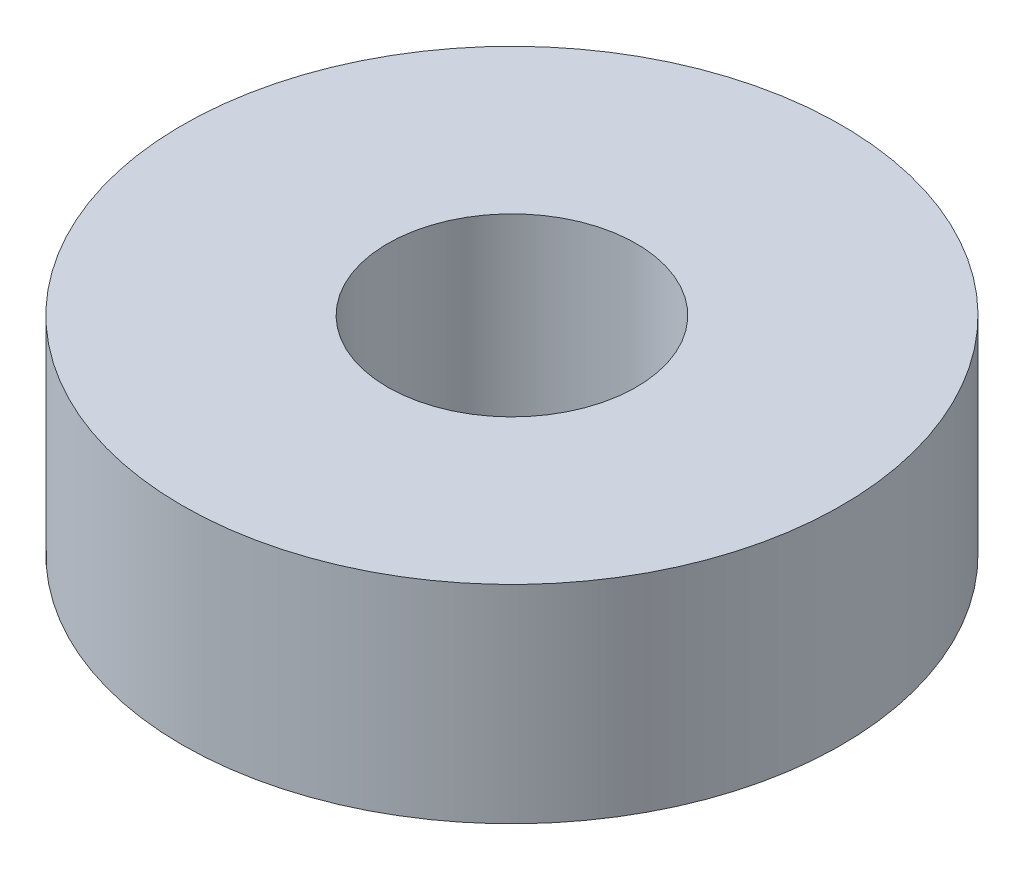
ISO-10303-21;
HEADER;
FILE_DESCRIPTION(('STEP AP214'),'2;1');
FILE_NAME('part.step','',(''),(''),'','','');
FILE_SCHEMA(('AUTOMOTIVE_DESIGN { 1 0 10303 214 1 1 1 1 }'));
ENDSEC;
DATA;
#1=APPLICATION_CONTEXT('core data for automotive mechanical design processes');
#2=APPLICATION_PROTOCOL_DEFINITION('international standard','automotive_design',2000,#1);
#3=PRODUCT_CONTEXT('',#1,'mechanical');
#4=PRODUCT('Part','Part','',(#3));
#5=PRODUCT_RELATED_PRODUCT_CATEGORY('part','',(#4));
#6=PRODUCT_DEFINITION_FORMATION('','',#4);
#7=PRODUCT_DEFINITION_CONTEXT('part definition',#1,'design');
#8=PRODUCT_DEFINITION('design','',#6,#7);
#9=PRODUCT_DEFINITION_SHAPE('','',#8);
#10=(LENGTH_UNIT() NAMED_UNIT(*) SI_UNIT(.MILLI.,.METRE.));
#11=(NAMED_UNIT(*) PLANE_ANGLE_UNIT() SI_UNIT($,.RADIAN.));
#12=(NAMED_UNIT(*) SI_UNIT($,.STERADIAN.) SOLID_ANGLE_UNIT());
#13=UNCERTAINTY_MEASURE_WITH_UNIT(LENGTH_MEASURE(1.E-05),#10,'distance_accuracy_value','');
#14=(GEOMETRIC_REPRESENTATION_CONTEXT(3) GLOBAL_UNCERTAINTY_ASSIGNED_CONTEXT((#13)) GLOBAL_UNIT_ASSIGNED_CONTEXT((#10,
#11,#12)) REPRESENTATION_CONTEXT('',''));
#15=CARTESIAN_POINT('',(0.,0.,0.));
#16=DIRECTION('',(0.,0.,1.));
#17=DIRECTION('',(1.,0.,0.));
#18=AXIS2_PLACEMENT_3D('',#15,#16,#17);
#19=CARTESIAN_POINT('',(0.,5.,0.));
#20=DIRECTION('',(0.,1.,0.));
#21=DIRECTION('',(0.,0.,1.));
#22=AXIS2_PLACEMENT_3D('',#19,#20,#21);
#23=PLANE('',#22);
#24=CARTESIAN_POINT('',(0.,5.,0.));
#25=DIRECTION('',(0.,1.,0.));
#26=DIRECTION('',(0.,0.,1.));
#27=AXIS2_PLACEMENT_3D('',#24,#25,#26);
#28=CIRCLE('',#27,7.95);
#29=CARTESIAN_POINT('',(0.,5.,7.95));
#30=VERTEX_POINT('',#29);
#31=EDGE_CURVE('E10',#30,#30,#28,.T.);
#32=ORIENTED_EDGE('',*,*,#31,.T.);
#33=EDGE_LOOP('',(#32));
#34=FACE_BOUND('',#33,.T.);
#35=CARTESIAN_POINT('',(0.,5.,0.));
#36=DIRECTION('',(0.,1.,0.));
#37=DIRECTION('',(0.,0.,1.));
#38=AXIS2_PLACEMENT_3D('',#35,#36,#37);
#39=CIRCLE('',#38,3.);
#40=CARTESIAN_POINT('',(0.,5.,3.));
#41=VERTEX_POINT('',#40);
#42=EDGE_CURVE('E42',#41,#41,#39,.T.);
#43=ORIENTED_EDGE('',*,*,#42,.F.);
#44=EDGE_LOOP('',(#43));
#45=FACE_BOUND('',#44,.T.);
#46=ADVANCED_FACE('F31',(#34,#45),#23,.T.);
#47=CARTESIAN_POINT('',(0.,0.,0.));
#48=DIRECTION('',(0.,1.,0.));
#49=DIRECTION('',(0.,0.,1.));
#50=AXIS2_PLACEMENT_3D('',#47,#48,#49);
#51=PLANE('',#50);
#52=CARTESIAN_POINT('',(0.,0.,0.));
#53=DIRECTION('',(0.,1.,0.));
#54=DIRECTION('',(0.,0.,1.));
#55=AXIS2_PLACEMENT_3D('',#52,#53,#54);
#56=CIRCLE('',#55,7.95);
#57=CARTESIAN_POINT('',(0.,0.,7.95));
#58=VERTEX_POINT('',#57);
#59=EDGE_CURVE('E35',#58,#58,#56,.T.);
#60=ORIENTED_EDGE('',*,*,#59,.F.);
#61=EDGE_LOOP('',(#60));
#62=FACE_BOUND('',#61,.T.);
#63=CARTESIAN_POINT('',(0.,0.,0.));
#64=DIRECTION('',(0.,1.,0.));
#65=DIRECTION('',(0.,0.,1.));
#66=AXIS2_PLACEMENT_3D('',#63,#64,#65);
#67=CIRCLE('',#66,3.);
#68=CARTESIAN_POINT('',(0.,0.,3.));
#69=VERTEX_POINT('',#68);
#70=EDGE_CURVE('E44',#69,#69,#67,.T.);
#71=ORIENTED_EDGE('',*,*,#70,.T.);
#72=EDGE_LOOP('',(#71));
#73=FACE_BOUND('',#72,.T.);
#74=ADVANCED_FACE('F54',(#62,#73),#51,.F.);
#75=CARTESIAN_POINT('',(0.,5.,0.));
#76=DIRECTION('',(0.,-1.,0.));
#77=DIRECTION('',(0.,0.,-1.));
#78=AXIS2_PLACEMENT_3D('',#75,#76,#77);
#79=CYLINDRICAL_SURFACE('',#78,7.95);
#80=ORIENTED_EDGE('',*,*,#31,.F.);
#81=EDGE_LOOP('',(#80));
#82=FACE_BOUND('',#81,.T.);
#83=ORIENTED_EDGE('',*,*,#59,.T.);
#84=EDGE_LOOP('',(#83));
#85=FACE_BOUND('',#84,.T.);
#86=ADVANCED_FACE('F33',(#82,#85),#79,.T.);
#87=CARTESIAN_POINT('',(0.,5.,0.));
#88=DIRECTION('',(0.,-1.,0.));
#89=DIRECTION('',(0.,0.,-1.));
#90=AXIS2_PLACEMENT_3D('',#87,#88,#89);
#91=CYLINDRICAL_SURFACE('',#90,3.);
#92=ORIENTED_EDGE('',*,*,#42,.T.);
#93=EDGE_LOOP('',(#92));
#94=FACE_BOUND('',#93,.T.);
#95=ORIENTED_EDGE('',*,*,#70,.F.);
#96=EDGE_LOOP('',(#95));
#97=FACE_BOUND('',#96,.T.);
#98=ADVANCED_FACE('F50',(#94,#97),#91,.F.);
#99=CLOSED_SHELL('',(#46,#74,#86,#98));
#100=MANIFOLD_SOLID_BREP('B2',#99);
#101=ADVANCED_BREP_SHAPE_REPRESENTATION('',(#18,#100),#14);
#102=SHAPE_DEFINITION_REPRESENTATION(#9,#101);
ENDSEC;
END-ISO-10303-21;
